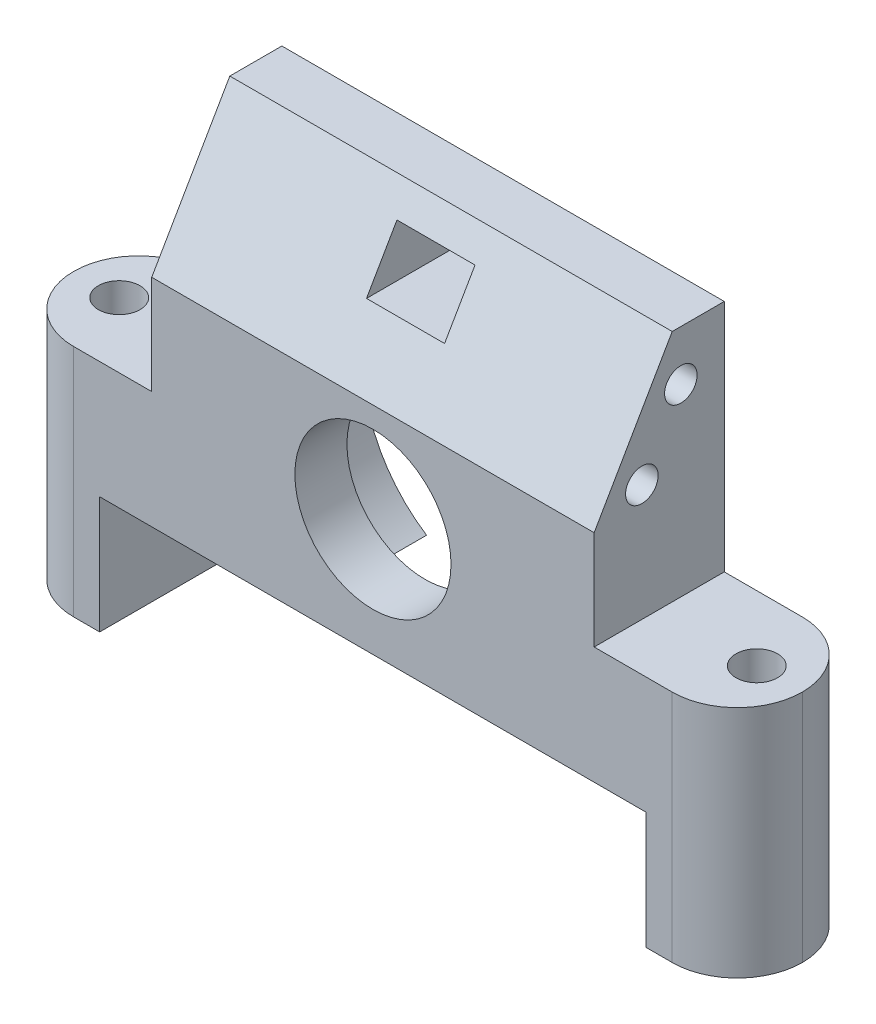
ISO-10303-21;
HEADER;
FILE_DESCRIPTION(('STEP AP214'),'2;1');
FILE_NAME('part.step','',(''),(''),'','','');
FILE_SCHEMA(('AUTOMOTIVE_DESIGN { 1 0 10303 214 1 1 1 1 }'));
ENDSEC;
DATA;
#1=APPLICATION_CONTEXT('core data for automotive mechanical design processes');
#2=APPLICATION_PROTOCOL_DEFINITION('international standard','automotive_design',2000,#1);
#3=PRODUCT_CONTEXT('',#1,'mechanical');
#4=PRODUCT('Part','Part','',(#3));
#5=PRODUCT_RELATED_PRODUCT_CATEGORY('part','',(#4));
#6=PRODUCT_DEFINITION_FORMATION('','',#4);
#7=PRODUCT_DEFINITION_CONTEXT('part definition',#1,'design');
#8=PRODUCT_DEFINITION('design','',#6,#7);
#9=PRODUCT_DEFINITION_SHAPE('','',#8);
#10=(LENGTH_UNIT() NAMED_UNIT(*) SI_UNIT(.MILLI.,.METRE.));
#11=(NAMED_UNIT(*) PLANE_ANGLE_UNIT() SI_UNIT($,.RADIAN.));
#12=(NAMED_UNIT(*) SI_UNIT($,.STERADIAN.) SOLID_ANGLE_UNIT());
#13=UNCERTAINTY_MEASURE_WITH_UNIT(LENGTH_MEASURE(1.E-05),#10,'distance_accuracy_value','');
#14=(GEOMETRIC_REPRESENTATION_CONTEXT(3) GLOBAL_UNCERTAINTY_ASSIGNED_CONTEXT((#13)) GLOBAL_UNIT_ASSIGNED_CONTEXT((#10,
#11,#12)) REPRESENTATION_CONTEXT('',''));
#15=CARTESIAN_POINT('',(0.,0.,0.));
#16=DIRECTION('',(0.,0.,1.));
#17=DIRECTION('',(1.,0.,0.));
#18=AXIS2_PLACEMENT_3D('',#15,#16,#17);
#19=CARTESIAN_POINT('',(17.,18.0000006532957,10.));
#20=DIRECTION('',(-1.,0.,0.));
#21=DIRECTION('',(0.,-1.,0.));
#22=AXIS2_PLACEMENT_3D('',#19,#20,#21);
#23=PLANE('',#22);
#24=DIRECTION('',(0.,0.,-1.));
#25=VECTOR('',#24,1.);
#26=CARTESIAN_POINT('',(17.,18.0000006532957,10.));
#27=LINE('',#26,#25);
#28=CARTESIAN_POINT('',(17.,18.0000006532957,3.99999999999999));
#29=VERTEX_POINT('',#28);
#30=CARTESIAN_POINT('',(17.,18.0000006532957,0.));
#31=VERTEX_POINT('',#30);
#32=EDGE_CURVE('E347',#29,#31,#27,.T.);
#33=ORIENTED_EDGE('',*,*,#32,.F.);
#34=DIRECTION('',(0.,0.866025403784438,-0.500000000000001));
#35=VECTOR('',#34,1.);
#36=CARTESIAN_POINT('',(17.,7.60769580788245,9.99999999999999));
#37=LINE('',#36,#35);
#38=CARTESIAN_POINT('',(17.,7.60769580788244,10.));
#39=VERTEX_POINT('',#38);
#40=EDGE_CURVE('E401',#29,#39,#37,.F.);
#41=ORIENTED_EDGE('',*,*,#40,.T.);
#42=DIRECTION('',(0.,1.,0.));
#43=VECTOR('',#42,1.);
#44=CARTESIAN_POINT('',(17.,18.0000006532957,10.));
#45=LINE('',#44,#43);
#46=CARTESIAN_POINT('',(17.,0.,10.));
#47=VERTEX_POINT('',#46);
#48=EDGE_CURVE('E327',#47,#39,#45,.T.);
#49=ORIENTED_EDGE('',*,*,#48,.F.);
#50=DIRECTION('',(0.,0.,-1.));
#51=VECTOR('',#50,1.);
#52=CARTESIAN_POINT('',(17.,0.,10.));
#53=LINE('',#52,#51);
#54=CARTESIAN_POINT('',(17.,0.,0.));
#55=VERTEX_POINT('',#54);
#56=EDGE_CURVE('E353',#47,#55,#53,.T.);
#57=ORIENTED_EDGE('',*,*,#56,.T.);
#58=DIRECTION('',(0.,1.,0.));
#59=VECTOR('',#58,1.);
#60=CARTESIAN_POINT('',(17.,18.0000006532957,0.));
#61=LINE('',#60,#59);
#62=EDGE_CURVE('E345',#55,#31,#61,.T.);
#63=ORIENTED_EDGE('',*,*,#62,.T.);
#64=EDGE_LOOP('',(#33,#41,#49,#57,#63));
#65=FACE_BOUND('',#64,.T.);
#66=CARTESIAN_POINT('',(17.,14.1500006532957,3.33604719043193));
#67=DIRECTION('',(-1.,0.,0.));
#68=DIRECTION('',(0.,0.,1.));
#69=AXIS2_PLACEMENT_3D('',#66,#67,#68);
#70=CIRCLE('',#69,1.25);
#71=CARTESIAN_POINT('',(17.,14.1500006532957,4.58604719043193));
#72=VERTEX_POINT('',#71);
#73=EDGE_CURVE('E244',#72,#72,#70,.T.);
#74=ORIENTED_EDGE('',*,*,#73,.T.);
#75=EDGE_LOOP('',(#74));
#76=FACE_BOUND('',#75,.T.);
#77=CARTESIAN_POINT('',(17.,8.9600006532957,6.33249508752609));
#78=DIRECTION('',(-1.,0.,0.));
#79=DIRECTION('',(0.,0.,1.));
#80=AXIS2_PLACEMENT_3D('',#77,#78,#79);
#81=CIRCLE('',#80,1.25);
#82=CARTESIAN_POINT('',(17.,8.9600006532957,7.58249508752609));
#83=VERTEX_POINT('',#82);
#84=EDGE_CURVE('E245',#83,#83,#81,.T.);
#85=ORIENTED_EDGE('',*,*,#84,.T.);
#86=EDGE_LOOP('',(#85));
#87=FACE_BOUND('',#86,.T.);
#88=ADVANCED_FACE('F48',(#65,#76,#87),#23,.F.);
#89=CARTESIAN_POINT('',(0.,6.53295697895827E-07,10.));
#90=DIRECTION('',(0.,0.,-1.));
#91=DIRECTION('',(-1.,0.,0.));
#92=AXIS2_PLACEMENT_3D('',#89,#90,#91);
#93=CYLINDRICAL_SURFACE('',#92,6.);
#94=CARTESIAN_POINT('',(0.,6.53295697895827E-07,10.));
#95=DIRECTION('',(0.,0.,1.));
#96=DIRECTION('',(1.,0.,0.));
#97=AXIS2_PLACEMENT_3D('',#94,#95,#96);
#98=CIRCLE('',#97,6.);
#99=CARTESIAN_POINT('',(5.99999999999999,6.53295697895827E-07,10.));
#100=VERTEX_POINT('',#99);
#101=EDGE_CURVE('E314',#100,#100,#98,.T.);
#102=ORIENTED_EDGE('',*,*,#101,.T.);
#103=EDGE_LOOP('',(#102));
#104=FACE_BOUND('',#103,.T.);
#105=CARTESIAN_POINT('',(0.,6.53295697895827E-07,6.));
#106=DIRECTION('',(0.,0.,-1.));
#107=DIRECTION('',(-1.,0.,0.));
#108=AXIS2_PLACEMENT_3D('',#105,#106,#107);
#109=CIRCLE('',#108,6.);
#110=CARTESIAN_POINT('',(-6.00000000000001,6.53295697895827E-07,6.));
#111=VERTEX_POINT('',#110);
#112=EDGE_CURVE('E311',#111,#111,#109,.T.);
#113=ORIENTED_EDGE('',*,*,#112,.T.);
#114=EDGE_LOOP('',(#113));
#115=FACE_BOUND('',#114,.T.);
#116=ADVANCED_FACE('F433',(#104,#115),#93,.F.);
#117=CARTESIAN_POINT('',(-17.,18.0000006532957,10.));
#118=DIRECTION('',(0.,0.,-1.));
#119=DIRECTION('',(-1.,0.,0.));
#120=AXIS2_PLACEMENT_3D('',#117,#118,#119);
#121=PLANE('',#120);
#122=ORIENTED_EDGE('',*,*,#48,.T.);
#123=DIRECTION('',(-1.,0.,0.));
#124=VECTOR('',#123,1.);
#125=CARTESIAN_POINT('',(-17.,7.60769580788244,10.));
#126=LINE('',#125,#124);
#127=CARTESIAN_POINT('',(-17.,7.60769580788244,10.));
#128=VERTEX_POINT('',#127);
#129=EDGE_CURVE('E391',#39,#128,#126,.T.);
#130=ORIENTED_EDGE('',*,*,#129,.T.);
#131=DIRECTION('',(0.,-1.,0.));
#132=VECTOR('',#131,1.);
#133=CARTESIAN_POINT('',(-17.,6.53295697895827E-07,10.));
#134=LINE('',#133,#132);
#135=CARTESIAN_POINT('',(-17.,6.53295697895827E-07,10.));
#136=VERTEX_POINT('',#135);
#137=EDGE_CURVE('E316',#128,#136,#134,.T.);
#138=ORIENTED_EDGE('',*,*,#137,.T.);
#139=DIRECTION('',(-1.,0.,0.));
#140=VECTOR('',#139,1.);
#141=CARTESIAN_POINT('',(-17.,6.53295697895827E-07,10.));
#142=LINE('',#141,#140);
#143=CARTESIAN_POINT('',(-23.,6.53295697161039E-07,10.));
#144=VERTEX_POINT('',#143);
#145=EDGE_CURVE('E324',#136,#144,#142,.T.);
#146=ORIENTED_EDGE('',*,*,#145,.T.);
#147=DIRECTION('',(0.,-1.,0.));
#148=VECTOR('',#147,1.);
#149=CARTESIAN_POINT('',(-23.,18.0000006532957,10.));
#150=LINE('',#149,#148);
#151=CARTESIAN_POINT('',(-23.,-17.9999993467043,10.));
#152=VERTEX_POINT('',#151);
#153=EDGE_CURVE('E362',#144,#152,#150,.T.);
#154=ORIENTED_EDGE('',*,*,#153,.T.);
#155=DIRECTION('',(1.,0.,0.));
#156=VECTOR('',#155,1.);
#157=CARTESIAN_POINT('',(0.,-17.9999993467043,10.));
#158=LINE('',#157,#156);
#159=CARTESIAN_POINT('',(-21.,-17.9999993467043,10.));
#160=VERTEX_POINT('',#159);
#161=EDGE_CURVE('E272',#152,#160,#158,.T.);
#162=ORIENTED_EDGE('',*,*,#161,.T.);
#163=DIRECTION('',(0.,1.,0.));
#164=VECTOR('',#163,1.);
#165=CARTESIAN_POINT('',(-21.,-17.9999993467043,10.));
#166=LINE('',#165,#164);
#167=CARTESIAN_POINT('',(-21.,-8.9999993467043,10.));
#168=VERTEX_POINT('',#167);
#169=EDGE_CURVE('E285',#160,#168,#166,.T.);
#170=ORIENTED_EDGE('',*,*,#169,.T.);
#171=DIRECTION('',(1.,0.,0.));
#172=VECTOR('',#171,1.);
#173=CARTESIAN_POINT('',(-28.,-8.9999993467043,10.));
#174=LINE('',#173,#172);
#175=CARTESIAN_POINT('',(21.,-8.9999993467043,10.));
#176=VERTEX_POINT('',#175);
#177=EDGE_CURVE('E322',#168,#176,#174,.T.);
#178=ORIENTED_EDGE('',*,*,#177,.T.);
#179=DIRECTION('',(0.,1.,0.));
#180=VECTOR('',#179,1.);
#181=CARTESIAN_POINT('',(21.,-17.9999993467043,10.));
#182=LINE('',#181,#180);
#183=CARTESIAN_POINT('',(21.,-17.9999993467043,10.));
#184=VERTEX_POINT('',#183);
#185=EDGE_CURVE('E294',#184,#176,#182,.T.);
#186=ORIENTED_EDGE('',*,*,#185,.F.);
#187=DIRECTION('',(1.,0.,0.));
#188=VECTOR('',#187,1.);
#189=CARTESIAN_POINT('',(0.,-17.9999993467043,10.));
#190=LINE('',#189,#188);
#191=CARTESIAN_POINT('',(23.,-17.9999993467043,10.));
#192=VERTEX_POINT('',#191);
#193=EDGE_CURVE('E292',#184,#192,#190,.T.);
#194=ORIENTED_EDGE('',*,*,#193,.T.);
#195=DIRECTION('',(0.,1.,0.));
#196=VECTOR('',#195,1.);
#197=CARTESIAN_POINT('',(23.,18.0000006532957,10.));
#198=LINE('',#197,#196);
#199=CARTESIAN_POINT('',(23.,0.,10.));
#200=VERTEX_POINT('',#199);
#201=EDGE_CURVE('E368',#192,#200,#198,.T.);
#202=ORIENTED_EDGE('',*,*,#201,.T.);
#203=DIRECTION('',(-1.,0.,0.));
#204=VECTOR('',#203,1.);
#205=CARTESIAN_POINT('',(17.,0.,10.));
#206=LINE('',#205,#204);
#207=EDGE_CURVE('E330',#200,#47,#206,.T.);
#208=ORIENTED_EDGE('',*,*,#207,.T.);
#209=EDGE_LOOP('',(#122,#130,#138,#146,#154,#162,#170,#178,#186,#194,#202,#208));
#210=FACE_BOUND('',#209,.T.);
#211=ORIENTED_EDGE('',*,*,#101,.F.);
#212=EDGE_LOOP('',(#211));
#213=FACE_BOUND('',#212,.T.);
#214=ADVANCED_FACE('F441',(#210,#213),#121,.F.);
#215=CARTESIAN_POINT('',(-17.,18.0000006532957,0.));
#216=DIRECTION('',(0.,0.,-1.));
#217=DIRECTION('',(-1.,0.,0.));
#218=AXIS2_PLACEMENT_3D('',#215,#216,#217);
#219=PLANE('',#218);
#220=DIRECTION('',(0.,-1.,0.));
#221=VECTOR('',#220,1.);
#222=CARTESIAN_POINT('',(3.,16.,0.));
#223=LINE('',#222,#221);
#224=CARTESIAN_POINT('',(3.,16.,0.));
#225=VERTEX_POINT('',#224);
#226=CARTESIAN_POINT('',(3.,11.9470597491027,0.));
#227=VERTEX_POINT('',#226);
#228=EDGE_CURVE('E65',#225,#227,#223,.T.);
#229=ORIENTED_EDGE('',*,*,#228,.F.);
#230=DIRECTION('',(1.,0.,0.));
#231=VECTOR('',#230,1.);
#232=CARTESIAN_POINT('',(3.,16.,0.));
#233=LINE('',#232,#231);
#234=CARTESIAN_POINT('',(-3.,16.,0.));
#235=VERTEX_POINT('',#234);
#236=EDGE_CURVE('E223',#235,#225,#233,.T.);
#237=ORIENTED_EDGE('',*,*,#236,.F.);
#238=DIRECTION('',(0.,1.,0.));
#239=VECTOR('',#238,1.);
#240=CARTESIAN_POINT('',(-3.,16.,0.));
#241=LINE('',#240,#239);
#242=CARTESIAN_POINT('',(-3.,11.9470597491027,0.));
#243=VERTEX_POINT('',#242);
#244=EDGE_CURVE('E204',#243,#235,#241,.T.);
#245=ORIENTED_EDGE('',*,*,#244,.F.);
#246=DIRECTION('',(-1.,0.,0.));
#247=VECTOR('',#246,1.);
#248=CARTESIAN_POINT('',(3.,11.9470597491027,0.));
#249=LINE('',#248,#247);
#250=EDGE_CURVE('E213',#227,#243,#249,.T.);
#251=ORIENTED_EDGE('',*,*,#250,.F.);
#252=EDGE_LOOP('',(#229,#237,#245,#251));
#253=FACE_BOUND('',#252,.T.);
#254=DIRECTION('',(-1.,0.,0.));
#255=VECTOR('',#254,1.);
#256=CARTESIAN_POINT('',(17.,0.,0.));
#257=LINE('',#256,#255);
#258=CARTESIAN_POINT('',(23.,0.,0.));
#259=VERTEX_POINT('',#258);
#260=EDGE_CURVE('E344',#259,#55,#257,.T.);
#261=ORIENTED_EDGE('',*,*,#260,.F.);
#262=DIRECTION('',(0.,1.,0.));
#263=VECTOR('',#262,1.);
#264=CARTESIAN_POINT('',(23.,-17.9999993467043,0.));
#265=LINE('',#264,#263);
#266=CARTESIAN_POINT('',(23.,-17.9999993467043,0.));
#267=VERTEX_POINT('',#266);
#268=EDGE_CURVE('E382',#259,#267,#265,.F.);
#269=ORIENTED_EDGE('',*,*,#268,.T.);
#270=DIRECTION('',(1.,0.,0.));
#271=VECTOR('',#270,1.);
#272=CARTESIAN_POINT('',(0.,-17.9999993467043,0.));
#273=LINE('',#272,#271);
#274=CARTESIAN_POINT('',(21.,-17.9999993467043,0.));
#275=VERTEX_POINT('',#274);
#276=EDGE_CURVE('E287',#275,#267,#273,.T.);
#277=ORIENTED_EDGE('',*,*,#276,.F.);
#278=DIRECTION('',(0.,1.,0.));
#279=VECTOR('',#278,1.);
#280=CARTESIAN_POINT('',(21.,-17.9999993467043,0.));
#281=LINE('',#280,#279);
#282=CARTESIAN_POINT('',(21.,-8.9999993467043,0.));
#283=VERTEX_POINT('',#282);
#284=EDGE_CURVE('E297',#275,#283,#281,.T.);
#285=ORIENTED_EDGE('',*,*,#284,.T.);
#286=DIRECTION('',(1.,0.,0.));
#287=VECTOR('',#286,1.);
#288=CARTESIAN_POINT('',(-28.,-8.9999993467043,0.));
#289=LINE('',#288,#287);
#290=CARTESIAN_POINT('',(5.87898900826682,-8.9999993467043,0.));
#291=VERTEX_POINT('',#290);
#292=EDGE_CURVE('E336',#291,#283,#289,.T.);
#293=ORIENTED_EDGE('',*,*,#292,.F.);
#294=CARTESIAN_POINT('',(0.,0.,0.));
#295=DIRECTION('',(0.,0.,-1.));
#296=DIRECTION('',(-1.,0.,0.));
#297=AXIS2_PLACEMENT_3D('',#294,#295,#296);
#298=CIRCLE('',#297,10.75);
#299=CARTESIAN_POINT('',(-5.87898900826682,-8.9999993467043,0.));
#300=VERTEX_POINT('',#299);
#301=EDGE_CURVE('E308',#300,#291,#298,.T.);
#302=ORIENTED_EDGE('',*,*,#301,.F.);
#303=CARTESIAN_POINT('',(-21.,-8.9999993467043,0.));
#304=VERTEX_POINT('',#303);
#305=EDGE_CURVE('E339',#304,#300,#289,.T.);
#306=ORIENTED_EDGE('',*,*,#305,.F.);
#307=DIRECTION('',(0.,1.,0.));
#308=VECTOR('',#307,1.);
#309=CARTESIAN_POINT('',(-21.,-17.9999993467043,0.));
#310=LINE('',#309,#308);
#311=CARTESIAN_POINT('',(-21.,-17.9999993467043,0.));
#312=VERTEX_POINT('',#311);
#313=EDGE_CURVE('E279',#312,#304,#310,.T.);
#314=ORIENTED_EDGE('',*,*,#313,.F.);
#315=DIRECTION('',(1.,0.,0.));
#316=VECTOR('',#315,1.);
#317=CARTESIAN_POINT('',(0.,-17.9999993467043,0.));
#318=LINE('',#317,#316);
#319=CARTESIAN_POINT('',(-23.,-17.9999993467043,0.));
#320=VERTEX_POINT('',#319);
#321=EDGE_CURVE('E274',#320,#312,#318,.T.);
#322=ORIENTED_EDGE('',*,*,#321,.F.);
#323=DIRECTION('',(0.,-1.,0.));
#324=VECTOR('',#323,1.);
#325=CARTESIAN_POINT('',(-23.,6.53295696548716E-07,0.));
#326=LINE('',#325,#324);
#327=CARTESIAN_POINT('',(-23.,6.53295697161039E-07,0.));
#328=VERTEX_POINT('',#327);
#329=EDGE_CURVE('E378',#320,#328,#326,.F.);
#330=ORIENTED_EDGE('',*,*,#329,.T.);
#331=DIRECTION('',(-1.,0.,0.));
#332=VECTOR('',#331,1.);
#333=CARTESIAN_POINT('',(-17.,6.53295697895827E-07,0.));
#334=LINE('',#333,#332);
#335=CARTESIAN_POINT('',(-17.,6.53295697895827E-07,0.));
#336=VERTEX_POINT('',#335);
#337=EDGE_CURVE('E334',#336,#328,#334,.T.);
#338=ORIENTED_EDGE('',*,*,#337,.F.);
#339=DIRECTION('',(0.,-1.,0.));
#340=VECTOR('',#339,1.);
#341=CARTESIAN_POINT('',(-17.,6.53295697895827E-07,0.));
#342=LINE('',#341,#340);
#343=CARTESIAN_POINT('',(-17.,18.0000006532957,0.));
#344=VERTEX_POINT('',#343);
#345=EDGE_CURVE('E319',#344,#336,#342,.T.);
#346=ORIENTED_EDGE('',*,*,#345,.F.);
#347=DIRECTION('',(-1.,0.,0.));
#348=VECTOR('',#347,1.);
#349=CARTESIAN_POINT('',(-17.,18.0000006532957,0.));
#350=LINE('',#349,#348);
#351=EDGE_CURVE('E321',#31,#344,#350,.T.);
#352=ORIENTED_EDGE('',*,*,#351,.F.);
#353=ORIENTED_EDGE('',*,*,#62,.F.);
#354=EDGE_LOOP('',(#261,#269,#277,#285,#293,#302,#306,#314,#322,#330,#338,#346,#352,#353));
#355=FACE_BOUND('',#354,.T.);
#356=ADVANCED_FACE('F218',(#253,#355),#219,.T.);
#357=CARTESIAN_POINT('',(-17.,6.53295697895827E-07,10.));
#358=DIRECTION('',(1.,0.,0.));
#359=DIRECTION('',(0.,0.,-1.));
#360=AXIS2_PLACEMENT_3D('',#357,#358,#359);
#361=PLANE('',#360);
#362=CARTESIAN_POINT('',(-17.,8.9600006532957,6.33249508752609));
#363=DIRECTION('',(-1.,0.,0.));
#364=DIRECTION('',(0.,0.,1.));
#365=AXIS2_PLACEMENT_3D('',#362,#363,#364);
#366=CIRCLE('',#365,1.25);
#367=CARTESIAN_POINT('',(-17.,8.9600006532957,7.58249508752609));
#368=VERTEX_POINT('',#367);
#369=EDGE_CURVE('E247',#368,#368,#366,.T.);
#370=ORIENTED_EDGE('',*,*,#369,.F.);
#371=EDGE_LOOP('',(#370));
#372=FACE_BOUND('',#371,.T.);
#373=CARTESIAN_POINT('',(-17.,14.1500006532957,3.33604719043193));
#374=DIRECTION('',(-1.,0.,0.));
#375=DIRECTION('',(0.,0.,1.));
#376=AXIS2_PLACEMENT_3D('',#373,#374,#375);
#377=CIRCLE('',#376,1.25);
#378=CARTESIAN_POINT('',(-17.,14.1500006532957,4.58604719043193));
#379=VERTEX_POINT('',#378);
#380=EDGE_CURVE('E252',#379,#379,#377,.T.);
#381=ORIENTED_EDGE('',*,*,#380,.F.);
#382=EDGE_LOOP('',(#381));
#383=FACE_BOUND('',#382,.T.);
#384=ORIENTED_EDGE('',*,*,#137,.F.);
#385=DIRECTION('',(0.,-0.866025403784438,0.500000000000001));
#386=VECTOR('',#385,1.);
#387=CARTESIAN_POINT('',(-17.,7.60769580788244,10.));
#388=LINE('',#387,#386);
#389=CARTESIAN_POINT('',(-17.,18.0000006532957,3.99999999999999));
#390=VERTEX_POINT('',#389);
#391=EDGE_CURVE('E397',#128,#390,#388,.F.);
#392=ORIENTED_EDGE('',*,*,#391,.T.);
#393=DIRECTION('',(0.,0.,-1.));
#394=VECTOR('',#393,1.);
#395=CARTESIAN_POINT('',(-17.,18.0000006532957,10.));
#396=LINE('',#395,#394);
#397=EDGE_CURVE('E335',#390,#344,#396,.T.);
#398=ORIENTED_EDGE('',*,*,#397,.T.);
#399=ORIENTED_EDGE('',*,*,#345,.T.);
#400=DIRECTION('',(0.,0.,-1.));
#401=VECTOR('',#400,1.);
#402=CARTESIAN_POINT('',(-17.,6.53295697895827E-07,10.));
#403=LINE('',#402,#401);
#404=EDGE_CURVE('E352',#136,#336,#403,.T.);
#405=ORIENTED_EDGE('',*,*,#404,.F.);
#406=EDGE_LOOP('',(#384,#392,#398,#399,#405));
#407=FACE_BOUND('',#406,.T.);
#408=ADVANCED_FACE('F463',(#372,#383,#407),#361,.F.);
#409=CARTESIAN_POINT('',(-17.,6.53295697895827E-07,10.));
#410=DIRECTION('',(0.,-1.,0.));
#411=DIRECTION('',(1.,0.,0.));
#412=AXIS2_PLACEMENT_3D('',#409,#410,#411);
#413=PLANE('',#412);
#414=CARTESIAN_POINT('',(-24.5,0.,5.));
#415=DIRECTION('',(0.,1.,0.));
#416=DIRECTION('',(0.,0.,1.));
#417=AXIS2_PLACEMENT_3D('',#414,#415,#416);
#418=CIRCLE('',#417,1.6);
#419=CARTESIAN_POINT('',(-24.5,0.,6.6));
#420=VERTEX_POINT('',#419);
#421=EDGE_CURVE('E305',#420,#420,#418,.T.);
#422=ORIENTED_EDGE('',*,*,#421,.F.);
#423=EDGE_LOOP('',(#422));
#424=FACE_BOUND('',#423,.T.);
#425=CARTESIAN_POINT('',(-23.,6.53295697161039E-07,5.));
#426=DIRECTION('',(0.,-1.,0.));
#427=DIRECTION('',(1.,0.,0.));
#428=AXIS2_PLACEMENT_3D('',#425,#426,#427);
#429=CIRCLE('',#428,5.);
#430=CARTESIAN_POINT('',(-28.,6.53295696548716E-07,5.));
#431=VERTEX_POINT('',#430);
#432=EDGE_CURVE('E386',#328,#431,#429,.F.);
#433=ORIENTED_EDGE('',*,*,#432,.T.);
#434=CARTESIAN_POINT('',(-23.,6.53295698788137E-07,5.));
#435=DIRECTION('',(0.,-1.,0.));
#436=DIRECTION('',(1.,0.,0.));
#437=AXIS2_PLACEMENT_3D('',#434,#435,#436);
#438=CIRCLE('',#437,5.);
#439=EDGE_CURVE('E388',#431,#144,#438,.F.);
#440=ORIENTED_EDGE('',*,*,#439,.T.);
#441=ORIENTED_EDGE('',*,*,#145,.F.);
#442=ORIENTED_EDGE('',*,*,#404,.T.);
#443=ORIENTED_EDGE('',*,*,#337,.T.);
#444=EDGE_LOOP('',(#433,#440,#441,#442,#443));
#445=FACE_BOUND('',#444,.T.);
#446=ADVANCED_FACE('F460',(#424,#445),#413,.F.);
#447=CARTESIAN_POINT('',(-28.,-8.9999993467043,10.));
#448=DIRECTION('',(0.,1.,0.));
#449=DIRECTION('',(0.,0.,1.));
#450=AXIS2_PLACEMENT_3D('',#447,#448,#449);
#451=PLANE('',#450);
#452=ORIENTED_EDGE('',*,*,#177,.F.);
#453=DIRECTION('',(0.,0.,-1.));
#454=VECTOR('',#453,1.);
#455=CARTESIAN_POINT('',(-21.,-8.9999993467043,0.));
#456=LINE('',#455,#454);
#457=EDGE_CURVE('E275',#168,#304,#456,.T.);
#458=ORIENTED_EDGE('',*,*,#457,.T.);
#459=ORIENTED_EDGE('',*,*,#305,.T.);
#460=DIRECTION('',(0.,0.,-1.));
#461=VECTOR('',#460,1.);
#462=CARTESIAN_POINT('',(-5.87898900826682,-8.9999993467043,6.));
#463=LINE('',#462,#461);
#464=CARTESIAN_POINT('',(-5.87898900826682,-8.9999993467043,6.));
#465=VERTEX_POINT('',#464);
#466=EDGE_CURVE('E357',#300,#465,#463,.F.);
#467=ORIENTED_EDGE('',*,*,#466,.T.);
#468=DIRECTION('',(-1.,0.,0.));
#469=VECTOR('',#468,1.);
#470=CARTESIAN_POINT('',(-28.,-8.9999993467043,6.));
#471=LINE('',#470,#469);
#472=CARTESIAN_POINT('',(5.87898900826682,-8.9999993467043,6.));
#473=VERTEX_POINT('',#472);
#474=EDGE_CURVE('E312',#473,#465,#471,.T.);
#475=ORIENTED_EDGE('',*,*,#474,.F.);
#476=DIRECTION('',(0.,0.,-1.));
#477=VECTOR('',#476,1.);
#478=CARTESIAN_POINT('',(5.87898900826682,-8.9999993467043,6.));
#479=LINE('',#478,#477);
#480=EDGE_CURVE('E365',#473,#291,#479,.T.);
#481=ORIENTED_EDGE('',*,*,#480,.T.);
#482=ORIENTED_EDGE('',*,*,#292,.T.);
#483=DIRECTION('',(0.,0.,1.));
#484=VECTOR('',#483,1.);
#485=CARTESIAN_POINT('',(21.,-8.9999993467043,0.));
#486=LINE('',#485,#484);
#487=EDGE_CURVE('E284',#283,#176,#486,.T.);
#488=ORIENTED_EDGE('',*,*,#487,.T.);
#489=EDGE_LOOP('',(#452,#458,#459,#467,#475,#481,#482,#488));
#490=FACE_BOUND('',#489,.T.);
#491=ADVANCED_FACE('F455',(#490),#451,.F.);
#492=CARTESIAN_POINT('',(17.,0.,10.));
#493=DIRECTION('',(0.,-1.,0.));
#494=DIRECTION('',(0.,0.,-1.));
#495=AXIS2_PLACEMENT_3D('',#492,#493,#494);
#496=PLANE('',#495);
#497=CARTESIAN_POINT('',(24.5,0.,5.));
#498=DIRECTION('',(0.,1.,0.));
#499=DIRECTION('',(0.,0.,1.));
#500=AXIS2_PLACEMENT_3D('',#497,#498,#499);
#501=CIRCLE('',#500,1.6);
#502=CARTESIAN_POINT('',(24.5,0.,6.6));
#503=VERTEX_POINT('',#502);
#504=EDGE_CURVE('E304',#503,#503,#501,.T.);
#505=ORIENTED_EDGE('',*,*,#504,.F.);
#506=EDGE_LOOP('',(#505));
#507=FACE_BOUND('',#506,.T.);
#508=ORIENTED_EDGE('',*,*,#207,.F.);
#509=CARTESIAN_POINT('',(23.,0.,5.));
#510=DIRECTION('',(0.,-1.,0.));
#511=DIRECTION('',(0.,0.,-1.));
#512=AXIS2_PLACEMENT_3D('',#509,#510,#511);
#513=CIRCLE('',#512,5.);
#514=CARTESIAN_POINT('',(28.,0.,5.));
#515=VERTEX_POINT('',#514);
#516=EDGE_CURVE('E373',#200,#515,#513,.F.);
#517=ORIENTED_EDGE('',*,*,#516,.T.);
#518=CARTESIAN_POINT('',(23.,0.,5.));
#519=DIRECTION('',(0.,-1.,0.));
#520=DIRECTION('',(0.,0.,-1.));
#521=AXIS2_PLACEMENT_3D('',#518,#519,#520);
#522=CIRCLE('',#521,5.);
#523=EDGE_CURVE('E371',#515,#259,#522,.F.);
#524=ORIENTED_EDGE('',*,*,#523,.T.);
#525=ORIENTED_EDGE('',*,*,#260,.T.);
#526=ORIENTED_EDGE('',*,*,#56,.F.);
#527=EDGE_LOOP('',(#508,#517,#524,#525,#526));
#528=FACE_BOUND('',#527,.T.);
#529=ADVANCED_FACE('F448',(#507,#528),#496,.F.);
#530=CARTESIAN_POINT('',(-17.,18.0000006532957,10.));
#531=DIRECTION('',(0.,-1.,0.));
#532=DIRECTION('',(0.,0.,-1.));
#533=AXIS2_PLACEMENT_3D('',#530,#531,#532);
#534=PLANE('',#533);
#535=ORIENTED_EDGE('',*,*,#397,.F.);
#536=DIRECTION('',(1.,0.,0.));
#537=VECTOR('',#536,1.);
#538=CARTESIAN_POINT('',(-17.,18.0000006532957,3.99999999999999));
#539=LINE('',#538,#537);
#540=EDGE_CURVE('E402',#390,#29,#539,.T.);
#541=ORIENTED_EDGE('',*,*,#540,.T.);
#542=ORIENTED_EDGE('',*,*,#32,.T.);
#543=ORIENTED_EDGE('',*,*,#351,.T.);
#544=EDGE_LOOP('',(#535,#541,#542,#543));
#545=FACE_BOUND('',#544,.T.);
#546=ADVANCED_FACE('F449',(#545),#534,.F.);
#547=CARTESIAN_POINT('',(0.,0.,6.));
#548=DIRECTION('',(0.,0.,-1.));
#549=DIRECTION('',(-1.,0.,0.));
#550=AXIS2_PLACEMENT_3D('',#547,#548,#549);
#551=CYLINDRICAL_SURFACE('',#550,10.75);
#552=CARTESIAN_POINT('',(0.,0.,6.));
#553=DIRECTION('',(0.,0.,-1.));
#554=DIRECTION('',(-1.,0.,0.));
#555=AXIS2_PLACEMENT_3D('',#552,#553,#554);
#556=CIRCLE('',#555,10.75);
#557=EDGE_CURVE('E307',#465,#473,#556,.T.);
#558=ORIENTED_EDGE('',*,*,#557,.F.);
#559=ORIENTED_EDGE('',*,*,#466,.F.);
#560=ORIENTED_EDGE('',*,*,#301,.T.);
#561=ORIENTED_EDGE('',*,*,#480,.F.);
#562=EDGE_LOOP('',(#558,#559,#560,#561));
#563=FACE_BOUND('',#562,.T.);
#564=ADVANCED_FACE('F534',(#563),#551,.F.);
#565=CARTESIAN_POINT('',(0.,0.,6.));
#566=DIRECTION('',(0.,0.,-1.));
#567=DIRECTION('',(-1.,0.,0.));
#568=AXIS2_PLACEMENT_3D('',#565,#566,#567);
#569=PLANE('',#568);
#570=ORIENTED_EDGE('',*,*,#112,.F.);
#571=EDGE_LOOP('',(#570));
#572=FACE_BOUND('',#571,.T.);
#573=ORIENTED_EDGE('',*,*,#474,.T.);
#574=ORIENTED_EDGE('',*,*,#557,.T.);
#575=EDGE_LOOP('',(#573,#574));
#576=FACE_BOUND('',#575,.T.);
#577=ADVANCED_FACE('F537',(#572,#576),#569,.T.);
#578=CARTESIAN_POINT('',(24.5,-13.5254827462982,5.));
#579=DIRECTION('',(0.,1.,0.));
#580=DIRECTION('',(0.,0.,1.));
#581=AXIS2_PLACEMENT_3D('',#578,#579,#580);
#582=CYLINDRICAL_SURFACE('',#581,1.6);
#583=CARTESIAN_POINT('',(24.5,-7.86995631575292,5.));
#584=DIRECTION('',(0.,-1.,0.));
#585=DIRECTION('',(0.,0.,-1.));
#586=AXIS2_PLACEMENT_3D('',#583,#584,#585);
#587=CIRCLE('',#586,1.6);
#588=CARTESIAN_POINT('',(24.5,-7.86995631575292,3.4));
#589=VERTEX_POINT('',#588);
#590=EDGE_CURVE('E270',#589,#589,#587,.T.);
#591=ORIENTED_EDGE('',*,*,#590,.T.);
#592=EDGE_LOOP('',(#591));
#593=FACE_BOUND('',#592,.T.);
#594=ORIENTED_EDGE('',*,*,#504,.T.);
#595=EDGE_LOOP('',(#594));
#596=FACE_BOUND('',#595,.T.);
#597=ADVANCED_FACE('F548',(#593,#596),#582,.F.);
#598=CARTESIAN_POINT('',(-24.5,-13.5254827462982,5.));
#599=DIRECTION('',(0.,1.,0.));
#600=DIRECTION('',(0.,0.,1.));
#601=AXIS2_PLACEMENT_3D('',#598,#599,#600);
#602=CYLINDRICAL_SURFACE('',#601,1.6);
#603=CARTESIAN_POINT('',(-24.5,-7.86995631575292,5.));
#604=DIRECTION('',(0.,-1.,0.));
#605=DIRECTION('',(0.,0.,-1.));
#606=AXIS2_PLACEMENT_3D('',#603,#604,#605);
#607=CIRCLE('',#606,1.6);
#608=CARTESIAN_POINT('',(-24.5,-7.86995631575292,3.4));
#609=VERTEX_POINT('',#608);
#610=EDGE_CURVE('E257',#609,#609,#607,.T.);
#611=ORIENTED_EDGE('',*,*,#610,.T.);
#612=EDGE_LOOP('',(#611));
#613=FACE_BOUND('',#612,.T.);
#614=ORIENTED_EDGE('',*,*,#421,.T.);
#615=EDGE_LOOP('',(#614));
#616=FACE_BOUND('',#615,.T.);
#617=ADVANCED_FACE('F758',(#613,#616),#602,.F.);
#618=CARTESIAN_POINT('',(21.,-17.9999993467043,0.));
#619=DIRECTION('',(-1.,0.,0.));
#620=DIRECTION('',(0.,0.,1.));
#621=AXIS2_PLACEMENT_3D('',#618,#619,#620);
#622=PLANE('',#621);
#623=ORIENTED_EDGE('',*,*,#487,.F.);
#624=ORIENTED_EDGE('',*,*,#284,.F.);
#625=DIRECTION('',(0.,0.,1.));
#626=VECTOR('',#625,1.);
#627=CARTESIAN_POINT('',(21.,-17.9999993467043,0.));
#628=LINE('',#627,#626);
#629=EDGE_CURVE('E288',#275,#184,#628,.T.);
#630=ORIENTED_EDGE('',*,*,#629,.T.);
#631=ORIENTED_EDGE('',*,*,#185,.T.);
#632=EDGE_LOOP('',(#623,#624,#630,#631));
#633=FACE_BOUND('',#632,.T.);
#634=ADVANCED_FACE('F514',(#633),#622,.T.);
#635=CARTESIAN_POINT('',(0.,-17.9999993467043,0.));
#636=DIRECTION('',(0.,-1.,0.));
#637=DIRECTION('',(0.,0.,-1.));
#638=AXIS2_PLACEMENT_3D('',#635,#636,#637);
#639=PLANE('',#638);
#640=CARTESIAN_POINT('',(24.5,-17.9999993467043,5.));
#641=DIRECTION('',(0.,-1.,0.));
#642=DIRECTION('',(0.,0.,-1.));
#643=AXIS2_PLACEMENT_3D('',#640,#641,#642);
#644=CIRCLE('',#643,1.65);
#645=CARTESIAN_POINT('',(24.5,-17.9999993467043,3.35));
#646=VERTEX_POINT('',#645);
#647=EDGE_CURVE('E261',#646,#646,#644,.T.);
#648=ORIENTED_EDGE('',*,*,#647,.F.);
#649=EDGE_LOOP('',(#648));
#650=FACE_BOUND('',#649,.T.);
#651=CARTESIAN_POINT('',(23.,-17.9999993467043,5.));
#652=DIRECTION('',(0.,-1.,0.));
#653=DIRECTION('',(0.,0.,-1.));
#654=AXIS2_PLACEMENT_3D('',#651,#652,#653);
#655=CIRCLE('',#654,5.);
#656=CARTESIAN_POINT('',(28.,-17.9999993467043,5.));
#657=VERTEX_POINT('',#656);
#658=EDGE_CURVE('E374',#267,#657,#655,.T.);
#659=ORIENTED_EDGE('',*,*,#658,.T.);
#660=CARTESIAN_POINT('',(23.,-17.9999993467043,5.));
#661=DIRECTION('',(0.,-1.,0.));
#662=DIRECTION('',(0.,0.,-1.));
#663=AXIS2_PLACEMENT_3D('',#660,#661,#662);
#664=CIRCLE('',#663,5.);
#665=EDGE_CURVE('E380',#657,#192,#664,.T.);
#666=ORIENTED_EDGE('',*,*,#665,.T.);
#667=ORIENTED_EDGE('',*,*,#193,.F.);
#668=ORIENTED_EDGE('',*,*,#629,.F.);
#669=ORIENTED_EDGE('',*,*,#276,.T.);
#670=EDGE_LOOP('',(#659,#666,#667,#668,#669));
#671=FACE_BOUND('',#670,.T.);
#672=ADVANCED_FACE('F520',(#650,#671),#639,.T.);
#673=CARTESIAN_POINT('',(-21.,-17.9999993467043,0.));
#674=DIRECTION('',(1.,0.,0.));
#675=DIRECTION('',(0.,0.,-1.));
#676=AXIS2_PLACEMENT_3D('',#673,#674,#675);
#677=PLANE('',#676);
#678=ORIENTED_EDGE('',*,*,#457,.F.);
#679=ORIENTED_EDGE('',*,*,#169,.F.);
#680=DIRECTION('',(0.,0.,-1.));
#681=VECTOR('',#680,1.);
#682=CARTESIAN_POINT('',(-21.,-17.9999993467043,0.));
#683=LINE('',#682,#681);
#684=EDGE_CURVE('E266',#160,#312,#683,.T.);
#685=ORIENTED_EDGE('',*,*,#684,.T.);
#686=ORIENTED_EDGE('',*,*,#313,.T.);
#687=EDGE_LOOP('',(#678,#679,#685,#686));
#688=FACE_BOUND('',#687,.T.);
#689=ADVANCED_FACE('F507',(#688),#677,.T.);
#690=CARTESIAN_POINT('',(0.,-17.9999993467043,0.));
#691=DIRECTION('',(0.,-1.,0.));
#692=DIRECTION('',(0.,0.,-1.));
#693=AXIS2_PLACEMENT_3D('',#690,#691,#692);
#694=PLANE('',#693);
#695=CARTESIAN_POINT('',(-24.5,-17.9999993467043,5.));
#696=DIRECTION('',(0.,-1.,0.));
#697=DIRECTION('',(0.,0.,-1.));
#698=AXIS2_PLACEMENT_3D('',#695,#696,#697);
#699=CIRCLE('',#698,1.65);
#700=CARTESIAN_POINT('',(-24.5,-17.9999993467043,3.35));
#701=VERTEX_POINT('',#700);
#702=EDGE_CURVE('E251',#701,#701,#699,.T.);
#703=ORIENTED_EDGE('',*,*,#702,.F.);
#704=EDGE_LOOP('',(#703));
#705=FACE_BOUND('',#704,.T.);
#706=ORIENTED_EDGE('',*,*,#161,.F.);
#707=CARTESIAN_POINT('',(-23.,-17.9999993467043,5.));
#708=DIRECTION('',(0.,-1.,0.));
#709=DIRECTION('',(0.,0.,-1.));
#710=AXIS2_PLACEMENT_3D('',#707,#708,#709);
#711=CIRCLE('',#710,5.);
#712=CARTESIAN_POINT('',(-28.,-17.9999993467043,5.));
#713=VERTEX_POINT('',#712);
#714=EDGE_CURVE('E383',#152,#713,#711,.T.);
#715=ORIENTED_EDGE('',*,*,#714,.T.);
#716=CARTESIAN_POINT('',(-23.,-17.9999993467043,5.));
#717=DIRECTION('',(0.,-1.,0.));
#718=DIRECTION('',(0.,0.,-1.));
#719=AXIS2_PLACEMENT_3D('',#716,#717,#718);
#720=CIRCLE('',#719,5.);
#721=EDGE_CURVE('E384',#713,#320,#720,.T.);
#722=ORIENTED_EDGE('',*,*,#721,.T.);
#723=ORIENTED_EDGE('',*,*,#321,.T.);
#724=ORIENTED_EDGE('',*,*,#684,.F.);
#725=EDGE_LOOP('',(#706,#715,#722,#723,#724));
#726=FACE_BOUND('',#725,.T.);
#727=ADVANCED_FACE('F475',(#705,#726),#694,.T.);
#728=CARTESIAN_POINT('',(23.,0.,5.));
#729=DIRECTION('',(0.,-1.,0.));
#730=DIRECTION('',(0.,0.,-1.));
#731=AXIS2_PLACEMENT_3D('',#728,#729,#730);
#732=CYLINDRICAL_SURFACE('',#731,5.);
#733=DIRECTION('',(0.,1.,0.));
#734=VECTOR('',#733,1.);
#735=CARTESIAN_POINT('',(28.,0.,5.));
#736=LINE('',#735,#734);
#737=EDGE_CURVE('E278',#657,#515,#736,.T.);
#738=ORIENTED_EDGE('',*,*,#737,.F.);
#739=ORIENTED_EDGE('',*,*,#658,.F.);
#740=ORIENTED_EDGE('',*,*,#268,.F.);
#741=ORIENTED_EDGE('',*,*,#523,.F.);
#742=EDGE_LOOP('',(#738,#739,#740,#741));
#743=FACE_BOUND('',#742,.T.);
#744=ADVANCED_FACE('F469',(#743),#732,.T.);
#745=CARTESIAN_POINT('',(23.,18.0000006532957,5.));
#746=DIRECTION('',(0.,1.,0.));
#747=DIRECTION('',(0.,0.,1.));
#748=AXIS2_PLACEMENT_3D('',#745,#746,#747);
#749=CYLINDRICAL_SURFACE('',#748,5.);
#750=ORIENTED_EDGE('',*,*,#665,.F.);
#751=ORIENTED_EDGE('',*,*,#737,.T.);
#752=ORIENTED_EDGE('',*,*,#516,.F.);
#753=ORIENTED_EDGE('',*,*,#201,.F.);
#754=EDGE_LOOP('',(#750,#751,#752,#753));
#755=FACE_BOUND('',#754,.T.);
#756=ADVANCED_FACE('F464',(#755),#749,.T.);
#757=CARTESIAN_POINT('',(-23.,6.53295696548716E-07,5.));
#758=DIRECTION('',(0.,1.,0.));
#759=DIRECTION('',(0.,0.,1.));
#760=AXIS2_PLACEMENT_3D('',#757,#758,#759);
#761=CYLINDRICAL_SURFACE('',#760,5.);
#762=DIRECTION('',(0.,-1.,0.));
#763=VECTOR('',#762,1.);
#764=CARTESIAN_POINT('',(-28.,-17.9999993467043,5.));
#765=LINE('',#764,#763);
#766=EDGE_CURVE('E392',#431,#713,#765,.T.);
#767=ORIENTED_EDGE('',*,*,#766,.F.);
#768=ORIENTED_EDGE('',*,*,#432,.F.);
#769=ORIENTED_EDGE('',*,*,#329,.F.);
#770=ORIENTED_EDGE('',*,*,#721,.F.);
#771=EDGE_LOOP('',(#767,#768,#769,#770));
#772=FACE_BOUND('',#771,.T.);
#773=ADVANCED_FACE('F466',(#772),#761,.T.);
#774=CARTESIAN_POINT('',(-23.,18.0000006532957,5.));
#775=DIRECTION('',(0.,-1.,0.));
#776=DIRECTION('',(0.,0.,-1.));
#777=AXIS2_PLACEMENT_3D('',#774,#775,#776);
#778=CYLINDRICAL_SURFACE('',#777,5.);
#779=ORIENTED_EDGE('',*,*,#439,.F.);
#780=ORIENTED_EDGE('',*,*,#766,.T.);
#781=ORIENTED_EDGE('',*,*,#714,.F.);
#782=ORIENTED_EDGE('',*,*,#153,.F.);
#783=EDGE_LOOP('',(#779,#780,#781,#782));
#784=FACE_BOUND('',#783,.T.);
#785=ADVANCED_FACE('F472',(#784),#778,.T.);
#786=CARTESIAN_POINT('',(-17.,7.60769580788244,10.));
#787=DIRECTION('',(0.,-0.500000000000001,-0.866025403784438));
#788=DIRECTION('',(0.,0.866025403784438,-0.500000000000001));
#789=AXIS2_PLACEMENT_3D('',#786,#787,#788);
#790=PLANE('',#789);
#791=DIRECTION('',(0.,-0.866025403784438,0.500000000000001));
#792=VECTOR('',#791,1.);
#793=CARTESIAN_POINT('',(3.,7.60769580788244,10.));
#794=LINE('',#793,#792);
#795=CARTESIAN_POINT('',(3.,11.9470597491027,7.49466706042474));
#796=VERTEX_POINT('',#795);
#797=CARTESIAN_POINT('',(3.,16.,5.15470091555969));
#798=VERTEX_POINT('',#797);
#799=EDGE_CURVE('E11',#796,#798,#794,.F.);
#800=ORIENTED_EDGE('',*,*,#799,.F.);
#801=DIRECTION('',(-1.,0.,0.));
#802=VECTOR('',#801,1.);
#803=CARTESIAN_POINT('',(-17.,11.9470597491027,7.49466706042474));
#804=LINE('',#803,#802);
#805=CARTESIAN_POINT('',(-3.,11.9470597491027,7.49466706042474));
#806=VERTEX_POINT('',#805);
#807=EDGE_CURVE('E403',#806,#796,#804,.F.);
#808=ORIENTED_EDGE('',*,*,#807,.F.);
#809=DIRECTION('',(0.,0.866025403784438,-0.500000000000001));
#810=VECTOR('',#809,1.);
#811=CARTESIAN_POINT('',(-3.,7.60769580788244,10.));
#812=LINE('',#811,#810);
#813=CARTESIAN_POINT('',(-3.,16.,5.1547009155597));
#814=VERTEX_POINT('',#813);
#815=EDGE_CURVE('E206',#814,#806,#812,.F.);
#816=ORIENTED_EDGE('',*,*,#815,.F.);
#817=DIRECTION('',(1.,0.,0.));
#818=VECTOR('',#817,1.);
#819=CARTESIAN_POINT('',(-17.,16.,5.15470091555969));
#820=LINE('',#819,#818);
#821=EDGE_CURVE('E57',#798,#814,#820,.F.);
#822=ORIENTED_EDGE('',*,*,#821,.F.);
#823=EDGE_LOOP('',(#800,#808,#816,#822));
#824=FACE_BOUND('',#823,.T.);
#825=ORIENTED_EDGE('',*,*,#40,.F.);
#826=ORIENTED_EDGE('',*,*,#540,.F.);
#827=ORIENTED_EDGE('',*,*,#391,.F.);
#828=ORIENTED_EDGE('',*,*,#129,.F.);
#829=EDGE_LOOP('',(#825,#826,#827,#828));
#830=FACE_BOUND('',#829,.T.);
#831=ADVANCED_FACE('F49',(#824,#830),#790,.F.);
#832=CARTESIAN_POINT('',(24.5,-7.8999993467043,5.));
#833=DIRECTION('',(0.,-1.,0.));
#834=DIRECTION('',(0.,0.,-1.));
#835=AXIS2_PLACEMENT_3D('',#832,#833,#834);
#836=CONICAL_SURFACE('',#835,1.65,1.02974425867665);
#837=CARTESIAN_POINT('',(24.5,-7.8999993467043,5.));
#838=DIRECTION('',(0.,-1.,0.));
#839=DIRECTION('',(0.,0.,-1.));
#840=AXIS2_PLACEMENT_3D('',#837,#838,#839);
#841=CIRCLE('',#840,1.65);
#842=CARTESIAN_POINT('',(24.5,-7.8999993467043,3.35));
#843=VERTEX_POINT('',#842);
#844=EDGE_CURVE('E262',#843,#843,#841,.T.);
#845=ORIENTED_EDGE('',*,*,#844,.T.);
#846=EDGE_LOOP('',(#845));
#847=FACE_BOUND('',#846,.T.);
#848=ORIENTED_EDGE('',*,*,#590,.F.);
#849=EDGE_LOOP('',(#848));
#850=FACE_BOUND('',#849,.T.);
#851=ADVANCED_FACE('F566',(#847,#850),#836,.F.);
#852=CARTESIAN_POINT('',(24.5,-17.9999993467043,5.));
#853=DIRECTION('',(0.,-1.,0.));
#854=DIRECTION('',(0.,0.,-1.));
#855=AXIS2_PLACEMENT_3D('',#852,#853,#854);
#856=CYLINDRICAL_SURFACE('',#855,1.65);
#857=ORIENTED_EDGE('',*,*,#844,.F.);
#858=EDGE_LOOP('',(#857));
#859=FACE_BOUND('',#858,.T.);
#860=ORIENTED_EDGE('',*,*,#647,.T.);
#861=EDGE_LOOP('',(#860));
#862=FACE_BOUND('',#861,.T.);
#863=ADVANCED_FACE('F584',(#859,#862),#856,.F.);
#864=CARTESIAN_POINT('',(-24.5,-7.8999993467043,5.));
#865=DIRECTION('',(0.,-1.,0.));
#866=DIRECTION('',(0.,0.,-1.));
#867=AXIS2_PLACEMENT_3D('',#864,#865,#866);
#868=CONICAL_SURFACE('',#867,1.65,1.02974425867665);
#869=CARTESIAN_POINT('',(-24.5,-7.8999993467043,5.));
#870=DIRECTION('',(0.,-1.,0.));
#871=DIRECTION('',(0.,0.,-1.));
#872=AXIS2_PLACEMENT_3D('',#869,#870,#871);
#873=CIRCLE('',#872,1.65);
#874=CARTESIAN_POINT('',(-24.5,-7.8999993467043,3.35));
#875=VERTEX_POINT('',#874);
#876=EDGE_CURVE('E256',#875,#875,#873,.T.);
#877=ORIENTED_EDGE('',*,*,#876,.T.);
#878=EDGE_LOOP('',(#877));
#879=FACE_BOUND('',#878,.T.);
#880=ORIENTED_EDGE('',*,*,#610,.F.);
#881=EDGE_LOOP('',(#880));
#882=FACE_BOUND('',#881,.T.);
#883=ADVANCED_FACE('F591',(#879,#882),#868,.F.);
#884=CARTESIAN_POINT('',(-24.5,-17.9999993467043,5.));
#885=DIRECTION('',(0.,-1.,0.));
#886=DIRECTION('',(0.,0.,-1.));
#887=AXIS2_PLACEMENT_3D('',#884,#885,#886);
#888=CYLINDRICAL_SURFACE('',#887,1.65);
#889=ORIENTED_EDGE('',*,*,#876,.F.);
#890=EDGE_LOOP('',(#889));
#891=FACE_BOUND('',#890,.T.);
#892=ORIENTED_EDGE('',*,*,#702,.T.);
#893=EDGE_LOOP('',(#892));
#894=FACE_BOUND('',#893,.T.);
#895=ADVANCED_FACE('F603',(#891,#894),#888,.F.);
#896=CARTESIAN_POINT('',(-13.,14.1500006532957,3.33604719043193));
#897=DIRECTION('',(-1.,0.,0.));
#898=DIRECTION('',(0.,0.,1.));
#899=AXIS2_PLACEMENT_3D('',#896,#897,#898);
#900=CYLINDRICAL_SURFACE('',#899,1.25);
#901=ORIENTED_EDGE('',*,*,#380,.T.);
#902=EDGE_LOOP('',(#901));
#903=FACE_BOUND('',#902,.T.);
#904=CARTESIAN_POINT('',(-12.5,14.1500006532957,3.33604719043193));
#905=DIRECTION('',(-1.,0.,0.));
#906=DIRECTION('',(0.,0.,1.));
#907=AXIS2_PLACEMENT_3D('',#904,#905,#906);
#908=CIRCLE('',#907,1.25);
#909=CARTESIAN_POINT('',(-12.5,14.1500006532957,4.58604719043193));
#910=VERTEX_POINT('',#909);
#911=EDGE_CURVE('E231',#910,#910,#908,.T.);
#912=ORIENTED_EDGE('',*,*,#911,.F.);
#913=EDGE_LOOP('',(#912));
#914=FACE_BOUND('',#913,.T.);
#915=ADVANCED_FACE('F614',(#903,#914),#900,.F.);
#916=CARTESIAN_POINT('',(-13.,8.9600006532957,6.33249508752609));
#917=DIRECTION('',(-1.,0.,0.));
#918=DIRECTION('',(0.,0.,1.));
#919=AXIS2_PLACEMENT_3D('',#916,#917,#918);
#920=CYLINDRICAL_SURFACE('',#919,1.25);
#921=ORIENTED_EDGE('',*,*,#369,.T.);
#922=EDGE_LOOP('',(#921));
#923=FACE_BOUND('',#922,.T.);
#924=CARTESIAN_POINT('',(-12.5,8.9600006532957,6.33249508752609));
#925=DIRECTION('',(-1.,0.,0.));
#926=DIRECTION('',(0.,0.,1.));
#927=AXIS2_PLACEMENT_3D('',#924,#925,#926);
#928=CIRCLE('',#927,1.25);
#929=CARTESIAN_POINT('',(-12.5,8.9600006532957,7.58249508752609));
#930=VERTEX_POINT('',#929);
#931=EDGE_CURVE('E226',#930,#930,#928,.T.);
#932=ORIENTED_EDGE('',*,*,#931,.F.);
#933=EDGE_LOOP('',(#932));
#934=FACE_BOUND('',#933,.T.);
#935=ADVANCED_FACE('F630',(#923,#934),#920,.F.);
#936=CARTESIAN_POINT('',(13.,14.1500006532957,3.33604719043193));
#937=DIRECTION('',(1.,0.,0.));
#938=DIRECTION('',(0.,0.,-1.));
#939=AXIS2_PLACEMENT_3D('',#936,#937,#938);
#940=CYLINDRICAL_SURFACE('',#939,1.25);
#941=ORIENTED_EDGE('',*,*,#73,.F.);
#942=EDGE_LOOP('',(#941));
#943=FACE_BOUND('',#942,.T.);
#944=CARTESIAN_POINT('',(12.5,14.1500006532957,3.33604719043193));
#945=DIRECTION('',(1.,0.,0.));
#946=DIRECTION('',(0.,0.,-1.));
#947=AXIS2_PLACEMENT_3D('',#944,#945,#946);
#948=CIRCLE('',#947,1.25);
#949=CARTESIAN_POINT('',(12.5,14.1500006532957,2.08604719043193));
#950=VERTEX_POINT('',#949);
#951=EDGE_CURVE('E237',#950,#950,#948,.T.);
#952=ORIENTED_EDGE('',*,*,#951,.F.);
#953=EDGE_LOOP('',(#952));
#954=FACE_BOUND('',#953,.T.);
#955=ADVANCED_FACE('F638',(#943,#954),#940,.F.);
#956=CARTESIAN_POINT('',(13.,8.9600006532957,6.33249508752609));
#957=DIRECTION('',(1.,0.,0.));
#958=DIRECTION('',(0.,0.,-1.));
#959=AXIS2_PLACEMENT_3D('',#956,#957,#958);
#960=CYLINDRICAL_SURFACE('',#959,1.25);
#961=ORIENTED_EDGE('',*,*,#84,.F.);
#962=EDGE_LOOP('',(#961));
#963=FACE_BOUND('',#962,.T.);
#964=CARTESIAN_POINT('',(12.5,8.9600006532957,6.33249508752609));
#965=DIRECTION('',(1.,0.,0.));
#966=DIRECTION('',(0.,0.,-1.));
#967=AXIS2_PLACEMENT_3D('',#964,#965,#966);
#968=CIRCLE('',#967,1.25);
#969=CARTESIAN_POINT('',(12.5,8.9600006532957,5.08249508752609));
#970=VERTEX_POINT('',#969);
#971=EDGE_CURVE('E236',#970,#970,#968,.T.);
#972=ORIENTED_EDGE('',*,*,#971,.F.);
#973=EDGE_LOOP('',(#972));
#974=FACE_BOUND('',#973,.T.);
#975=ADVANCED_FACE('F658',(#963,#974),#960,.F.);
#976=CARTESIAN_POINT('',(12.5,14.1500006532957,3.33604719043193));
#977=DIRECTION('',(1.,0.,0.));
#978=DIRECTION('',(0.,0.,-1.));
#979=AXIS2_PLACEMENT_3D('',#976,#977,#978);
#980=CONICAL_SURFACE('',#979,1.25,1.02974425867665);
#981=CARTESIAN_POINT('',(11.7489242262155,14.1500006532957,3.33604719043193));
#982=VERTEX_POINT('',#981);
#983=VERTEX_LOOP('',#982);
#984=FACE_BOUND('',#983,.T.);
#985=ORIENTED_EDGE('',*,*,#951,.T.);
#986=EDGE_LOOP('',(#985));
#987=FACE_BOUND('',#986,.T.);
#988=ADVANCED_FACE('F670',(#984,#987),#980,.F.);
#989=CARTESIAN_POINT('',(12.5,8.9600006532957,6.33249508752609));
#990=DIRECTION('',(1.,0.,0.));
#991=DIRECTION('',(0.,0.,-1.));
#992=AXIS2_PLACEMENT_3D('',#989,#990,#991);
#993=CONICAL_SURFACE('',#992,1.25,1.02974425867665);
#994=CARTESIAN_POINT('',(11.7489242262155,8.9600006532957,6.33249508752609));
#995=VERTEX_POINT('',#994);
#996=VERTEX_LOOP('',#995);
#997=FACE_BOUND('',#996,.T.);
#998=ORIENTED_EDGE('',*,*,#971,.T.);
#999=EDGE_LOOP('',(#998));
#1000=FACE_BOUND('',#999,.T.);
#1001=ADVANCED_FACE('F685',(#997,#1000),#993,.F.);
#1002=CARTESIAN_POINT('',(-12.5,14.1500006532957,3.33604719043193));
#1003=DIRECTION('',(-1.,0.,0.));
#1004=DIRECTION('',(0.,0.,1.));
#1005=AXIS2_PLACEMENT_3D('',#1002,#1003,#1004);
#1006=CONICAL_SURFACE('',#1005,1.25,1.02974425867665);
#1007=CARTESIAN_POINT('',(-11.7489242262155,14.1500006532957,3.33604719043193));
#1008=VERTEX_POINT('',#1007);
#1009=VERTEX_LOOP('',#1008);
#1010=FACE_BOUND('',#1009,.T.);
#1011=ORIENTED_EDGE('',*,*,#911,.T.);
#1012=EDGE_LOOP('',(#1011));
#1013=FACE_BOUND('',#1012,.T.);
#1014=ADVANCED_FACE('F426',(#1010,#1013),#1006,.F.);
#1015=CARTESIAN_POINT('',(-12.5,8.9600006532957,6.33249508752609));
#1016=DIRECTION('',(-1.,0.,0.));
#1017=DIRECTION('',(0.,0.,1.));
#1018=AXIS2_PLACEMENT_3D('',#1015,#1016,#1017);
#1019=CONICAL_SURFACE('',#1018,1.25,1.02974425867665);
#1020=CARTESIAN_POINT('',(-11.7489242262155,8.9600006532957,6.33249508752609));
#1021=VERTEX_POINT('',#1020);
#1022=VERTEX_LOOP('',#1021);
#1023=FACE_BOUND('',#1022,.T.);
#1024=ORIENTED_EDGE('',*,*,#931,.T.);
#1025=EDGE_LOOP('',(#1024));
#1026=FACE_BOUND('',#1025,.T.);
#1027=ADVANCED_FACE('F419',(#1023,#1026),#1019,.F.);
#1028=CARTESIAN_POINT('',(3.,16.,17.2406025078956));
#1029=DIRECTION('',(1.,0.,0.));
#1030=DIRECTION('',(0.,1.,0.));
#1031=AXIS2_PLACEMENT_3D('',#1028,#1029,#1030);
#1032=PLANE('',#1031);
#1033=ORIENTED_EDGE('',*,*,#799,.T.);
#1034=DIRECTION('',(0.,0.,-1.));
#1035=VECTOR('',#1034,1.);
#1036=CARTESIAN_POINT('',(3.,16.,17.2406025078956));
#1037=LINE('',#1036,#1035);
#1038=EDGE_CURVE('E228',#798,#225,#1037,.T.);
#1039=ORIENTED_EDGE('',*,*,#1038,.T.);
#1040=ORIENTED_EDGE('',*,*,#228,.T.);
#1041=DIRECTION('',(0.,0.,-1.));
#1042=VECTOR('',#1041,1.);
#1043=CARTESIAN_POINT('',(3.,11.9470597491027,17.2406025078956));
#1044=LINE('',#1043,#1042);
#1045=EDGE_CURVE('E214',#796,#227,#1044,.T.);
#1046=ORIENTED_EDGE('',*,*,#1045,.F.);
#1047=EDGE_LOOP('',(#1033,#1039,#1040,#1046));
#1048=FACE_BOUND('',#1047,.T.);
#1049=ADVANCED_FACE('F416',(#1048),#1032,.F.);
#1050=CARTESIAN_POINT('',(3.,16.,17.2406025078956));
#1051=DIRECTION('',(0.,1.,0.));
#1052=DIRECTION('',(0.,0.,1.));
#1053=AXIS2_PLACEMENT_3D('',#1050,#1051,#1052);
#1054=PLANE('',#1053);
#1055=ORIENTED_EDGE('',*,*,#821,.T.);
#1056=DIRECTION('',(0.,0.,-1.));
#1057=VECTOR('',#1056,1.);
#1058=CARTESIAN_POINT('',(-3.,16.,17.2406025078956));
#1059=LINE('',#1058,#1057);
#1060=EDGE_CURVE('E208',#814,#235,#1059,.T.);
#1061=ORIENTED_EDGE('',*,*,#1060,.T.);
#1062=ORIENTED_EDGE('',*,*,#236,.T.);
#1063=ORIENTED_EDGE('',*,*,#1038,.F.);
#1064=EDGE_LOOP('',(#1055,#1061,#1062,#1063));
#1065=FACE_BOUND('',#1064,.T.);
#1066=ADVANCED_FACE('F412',(#1065),#1054,.F.);
#1067=CARTESIAN_POINT('',(-3.,16.,17.2406025078956));
#1068=DIRECTION('',(-1.,0.,0.));
#1069=DIRECTION('',(0.,-1.,0.));
#1070=AXIS2_PLACEMENT_3D('',#1067,#1068,#1069);
#1071=PLANE('',#1070);
#1072=ORIENTED_EDGE('',*,*,#815,.T.);
#1073=DIRECTION('',(0.,0.,-1.));
#1074=VECTOR('',#1073,1.);
#1075=CARTESIAN_POINT('',(-3.,11.9470597491027,17.2406025078956));
#1076=LINE('',#1075,#1074);
#1077=EDGE_CURVE('E73',#806,#243,#1076,.T.);
#1078=ORIENTED_EDGE('',*,*,#1077,.T.);
#1079=ORIENTED_EDGE('',*,*,#244,.T.);
#1080=ORIENTED_EDGE('',*,*,#1060,.F.);
#1081=EDGE_LOOP('',(#1072,#1078,#1079,#1080));
#1082=FACE_BOUND('',#1081,.T.);
#1083=ADVANCED_FACE('F205',(#1082),#1071,.F.);
#1084=CARTESIAN_POINT('',(3.,11.9470597491027,17.2406025078956));
#1085=DIRECTION('',(0.,-1.,0.));
#1086=DIRECTION('',(0.,0.,-1.));
#1087=AXIS2_PLACEMENT_3D('',#1084,#1085,#1086);
#1088=PLANE('',#1087);
#1089=ORIENTED_EDGE('',*,*,#807,.T.);
#1090=ORIENTED_EDGE('',*,*,#1045,.T.);
#1091=ORIENTED_EDGE('',*,*,#250,.T.);
#1092=ORIENTED_EDGE('',*,*,#1077,.F.);
#1093=EDGE_LOOP('',(#1089,#1090,#1091,#1092));
#1094=FACE_BOUND('',#1093,.T.);
#1095=ADVANCED_FACE('F212',(#1094),#1088,.F.);
#1096=CLOSED_SHELL('',(#88,#116,#214,#356,#408,#446,#491,#529,#546,#564,#577,#597,#617,#634,
#672,#689,#727,#744,#756,#773,#785,#831,#851,#863,#883,#895,#915,#935,#955,#975,#988,#1001,
#1014,#1027,#1049,#1066,#1083,#1095));
#1097=MANIFOLD_SOLID_BREP('B2',#1096);
#1098=ADVANCED_BREP_SHAPE_REPRESENTATION('',(#18,#1097),#14);
#1099=SHAPE_DEFINITION_REPRESENTATION(#9,#1098);
ENDSEC;
END-ISO-10303-21;
